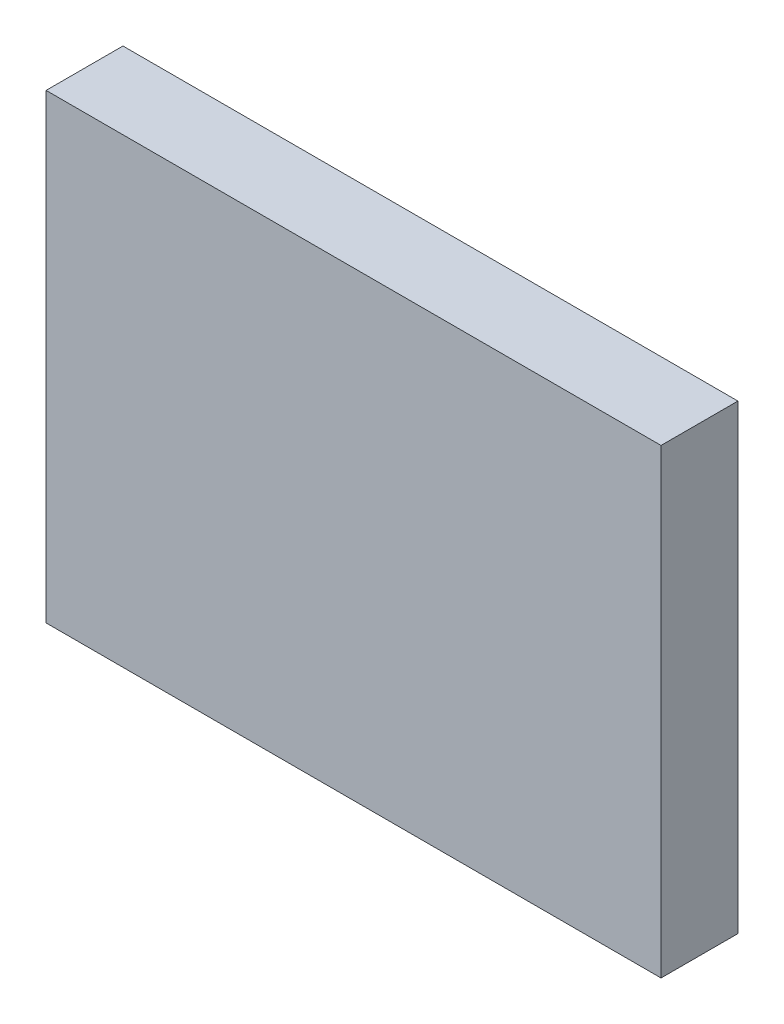
ISO-10303-21;
HEADER;
FILE_DESCRIPTION(('STEP AP214'),'2;1');
FILE_NAME('part.step','',(''),(''),'','','');
FILE_SCHEMA(('AUTOMOTIVE_DESIGN { 1 0 10303 214 1 1 1 1 }'));
ENDSEC;
DATA;
#1=APPLICATION_CONTEXT('core data for automotive mechanical design processes');
#2=APPLICATION_PROTOCOL_DEFINITION('international standard','automotive_design',2000,#1);
#3=PRODUCT_CONTEXT('',#1,'mechanical');
#4=PRODUCT('Part','Part','',(#3));
#5=PRODUCT_RELATED_PRODUCT_CATEGORY('part','',(#4));
#6=PRODUCT_DEFINITION_FORMATION('','',#4);
#7=PRODUCT_DEFINITION_CONTEXT('part definition',#1,'design');
#8=PRODUCT_DEFINITION('design','',#6,#7);
#9=PRODUCT_DEFINITION_SHAPE('','',#8);
#10=(LENGTH_UNIT() NAMED_UNIT(*) SI_UNIT(.MILLI.,.METRE.));
#11=(NAMED_UNIT(*) PLANE_ANGLE_UNIT() SI_UNIT($,.RADIAN.));
#12=(NAMED_UNIT(*) SI_UNIT($,.STERADIAN.) SOLID_ANGLE_UNIT());
#13=UNCERTAINTY_MEASURE_WITH_UNIT(LENGTH_MEASURE(1.E-05),#10,'distance_accuracy_value','');
#14=(GEOMETRIC_REPRESENTATION_CONTEXT(3) GLOBAL_UNCERTAINTY_ASSIGNED_CONTEXT((#13)) GLOBAL_UNIT_ASSIGNED_CONTEXT((#10,
#11,#12)) REPRESENTATION_CONTEXT('',''));
#15=CARTESIAN_POINT('',(0.,0.,0.));
#16=DIRECTION('',(0.,0.,1.));
#17=DIRECTION('',(1.,0.,0.));
#18=AXIS2_PLACEMENT_3D('',#15,#16,#17);
#19=CARTESIAN_POINT('',(50.8,-38.1,12.7));
#20=DIRECTION('',(-1.,0.,0.));
#21=DIRECTION('',(0.,0.,1.));
#22=AXIS2_PLACEMENT_3D('',#19,#20,#21);
#23=PLANE('',#22);
#24=DIRECTION('',(0.,1.,0.));
#25=VECTOR('',#24,1.);
#26=CARTESIAN_POINT('',(50.8,-38.1,0.));
#27=LINE('',#26,#25);
#28=CARTESIAN_POINT('',(50.8,-38.1,0.));
#29=VERTEX_POINT('',#28);
#30=CARTESIAN_POINT('',(50.8,38.1,0.));
#31=VERTEX_POINT('',#30);
#32=EDGE_CURVE('E95',#29,#31,#27,.T.);
#33=ORIENTED_EDGE('',*,*,#32,.T.);
#34=DIRECTION('',(0.,0.,-1.));
#35=VECTOR('',#34,1.);
#36=CARTESIAN_POINT('',(50.8,38.1,12.7));
#37=LINE('',#36,#35);
#38=CARTESIAN_POINT('',(50.8,38.1,12.7));
#39=VERTEX_POINT('',#38);
#40=EDGE_CURVE('E11',#39,#31,#37,.T.);
#41=ORIENTED_EDGE('',*,*,#40,.F.);
#42=DIRECTION('',(0.,1.,0.));
#43=VECTOR('',#42,1.);
#44=CARTESIAN_POINT('',(50.8,-38.1,12.7));
#45=LINE('',#44,#43);
#46=CARTESIAN_POINT('',(50.8,-38.1,12.7));
#47=VERTEX_POINT('',#46);
#48=EDGE_CURVE('E83',#47,#39,#45,.T.);
#49=ORIENTED_EDGE('',*,*,#48,.F.);
#50=DIRECTION('',(0.,0.,-1.));
#51=VECTOR('',#50,1.);
#52=CARTESIAN_POINT('',(50.8,-38.1,12.7));
#53=LINE('',#52,#51);
#54=EDGE_CURVE('E91',#47,#29,#53,.T.);
#55=ORIENTED_EDGE('',*,*,#54,.T.);
#56=EDGE_LOOP('',(#33,#41,#49,#55));
#57=FACE_BOUND('',#56,.T.);
#58=ADVANCED_FACE('F32',(#57),#23,.F.);
#59=CARTESIAN_POINT('',(-50.8,38.1,12.7));
#60=DIRECTION('',(0.,-1.,0.));
#61=DIRECTION('',(0.,0.,-1.));
#62=AXIS2_PLACEMENT_3D('',#59,#60,#61);
#63=PLANE('',#62);
#64=DIRECTION('',(-1.,0.,0.));
#65=VECTOR('',#64,1.);
#66=CARTESIAN_POINT('',(-50.8,38.1,0.));
#67=LINE('',#66,#65);
#68=CARTESIAN_POINT('',(-50.8,38.1,0.));
#69=VERTEX_POINT('',#68);
#70=EDGE_CURVE('E87',#31,#69,#67,.T.);
#71=ORIENTED_EDGE('',*,*,#70,.T.);
#72=DIRECTION('',(0.,0.,-1.));
#73=VECTOR('',#72,1.);
#74=CARTESIAN_POINT('',(-50.8,38.1,12.7));
#75=LINE('',#74,#73);
#76=CARTESIAN_POINT('',(-50.8,38.1,12.7));
#77=VERTEX_POINT('',#76);
#78=EDGE_CURVE('E40',#77,#69,#75,.T.);
#79=ORIENTED_EDGE('',*,*,#78,.F.);
#80=DIRECTION('',(-1.,0.,0.));
#81=VECTOR('',#80,1.);
#82=CARTESIAN_POINT('',(-50.8,38.1,12.7));
#83=LINE('',#82,#81);
#84=EDGE_CURVE('E78',#39,#77,#83,.T.);
#85=ORIENTED_EDGE('',*,*,#84,.F.);
#86=ORIENTED_EDGE('',*,*,#40,.T.);
#87=EDGE_LOOP('',(#71,#79,#85,#86));
#88=FACE_BOUND('',#87,.T.);
#89=ADVANCED_FACE('F86',(#88),#63,.F.);
#90=CARTESIAN_POINT('',(-50.8,-38.1,12.7));
#91=DIRECTION('',(1.,0.,0.));
#92=DIRECTION('',(0.,0.,-1.));
#93=AXIS2_PLACEMENT_3D('',#90,#91,#92);
#94=PLANE('',#93);
#95=DIRECTION('',(0.,-1.,0.));
#96=VECTOR('',#95,1.);
#97=CARTESIAN_POINT('',(-50.8,-38.1,0.));
#98=LINE('',#97,#96);
#99=CARTESIAN_POINT('',(-50.8,-38.1,0.));
#100=VERTEX_POINT('',#99);
#101=EDGE_CURVE('E65',#69,#100,#98,.T.);
#102=ORIENTED_EDGE('',*,*,#101,.T.);
#103=DIRECTION('',(0.,0.,-1.));
#104=VECTOR('',#103,1.);
#105=CARTESIAN_POINT('',(-50.8,-38.1,12.7));
#106=LINE('',#105,#104);
#107=CARTESIAN_POINT('',(-50.8,-38.1,12.7));
#108=VERTEX_POINT('',#107);
#109=EDGE_CURVE('E88',#108,#100,#106,.T.);
#110=ORIENTED_EDGE('',*,*,#109,.F.);
#111=DIRECTION('',(0.,-1.,0.));
#112=VECTOR('',#111,1.);
#113=CARTESIAN_POINT('',(-50.8,-38.1,12.7));
#114=LINE('',#113,#112);
#115=EDGE_CURVE('E81',#77,#108,#114,.T.);
#116=ORIENTED_EDGE('',*,*,#115,.F.);
#117=ORIENTED_EDGE('',*,*,#78,.T.);
#118=EDGE_LOOP('',(#102,#110,#116,#117));
#119=FACE_BOUND('',#118,.T.);
#120=ADVANCED_FACE('F89',(#119),#94,.F.);
#121=CARTESIAN_POINT('',(-50.8,-38.1,12.7));
#122=DIRECTION('',(0.,1.,0.));
#123=DIRECTION('',(0.,0.,1.));
#124=AXIS2_PLACEMENT_3D('',#121,#122,#123);
#125=PLANE('',#124);
#126=DIRECTION('',(1.,0.,0.));
#127=VECTOR('',#126,1.);
#128=CARTESIAN_POINT('',(-50.8,-38.1,0.));
#129=LINE('',#128,#127);
#130=EDGE_CURVE('E71',#100,#29,#129,.T.);
#131=ORIENTED_EDGE('',*,*,#130,.T.);
#132=ORIENTED_EDGE('',*,*,#54,.F.);
#133=DIRECTION('',(1.,0.,0.));
#134=VECTOR('',#133,1.);
#135=CARTESIAN_POINT('',(-50.8,-38.1,12.7));
#136=LINE('',#135,#134);
#137=EDGE_CURVE('E48',#108,#47,#136,.T.);
#138=ORIENTED_EDGE('',*,*,#137,.F.);
#139=ORIENTED_EDGE('',*,*,#109,.T.);
#140=EDGE_LOOP('',(#131,#132,#138,#139));
#141=FACE_BOUND('',#140,.T.);
#142=ADVANCED_FACE('F102',(#141),#125,.F.);
#143=CARTESIAN_POINT('',(0.,0.,12.7));
#144=DIRECTION('',(0.,0.,-1.));
#145=DIRECTION('',(-1.,0.,0.));
#146=AXIS2_PLACEMENT_3D('',#143,#144,#145);
#147=PLANE('',#146);
#148=ORIENTED_EDGE('',*,*,#48,.T.);
#149=ORIENTED_EDGE('',*,*,#84,.T.);
#150=ORIENTED_EDGE('',*,*,#115,.T.);
#151=ORIENTED_EDGE('',*,*,#137,.T.);
#152=EDGE_LOOP('',(#148,#149,#150,#151));
#153=FACE_BOUND('',#152,.T.);
#154=ADVANCED_FACE('F79',(#153),#147,.F.);
#155=CARTESIAN_POINT('',(0.,0.,0.));
#156=DIRECTION('',(0.,0.,-1.));
#157=DIRECTION('',(-1.,0.,0.));
#158=AXIS2_PLACEMENT_3D('',#155,#156,#157);
#159=PLANE('',#158);
#160=ORIENTED_EDGE('',*,*,#32,.F.);
#161=ORIENTED_EDGE('',*,*,#130,.F.);
#162=ORIENTED_EDGE('',*,*,#101,.F.);
#163=ORIENTED_EDGE('',*,*,#70,.F.);
#164=EDGE_LOOP('',(#160,#161,#162,#163));
#165=FACE_BOUND('',#164,.T.);
#166=ADVANCED_FACE('F105',(#165),#159,.T.);
#167=CLOSED_SHELL('',(#58,#89,#120,#142,#154,#166));
#168=MANIFOLD_SOLID_BREP('B2',#167);
#169=ADVANCED_BREP_SHAPE_REPRESENTATION('',(#18,#168),#14);
#170=SHAPE_DEFINITION_REPRESENTATION(#9,#169);
ENDSEC;
END-ISO-10303-21;
